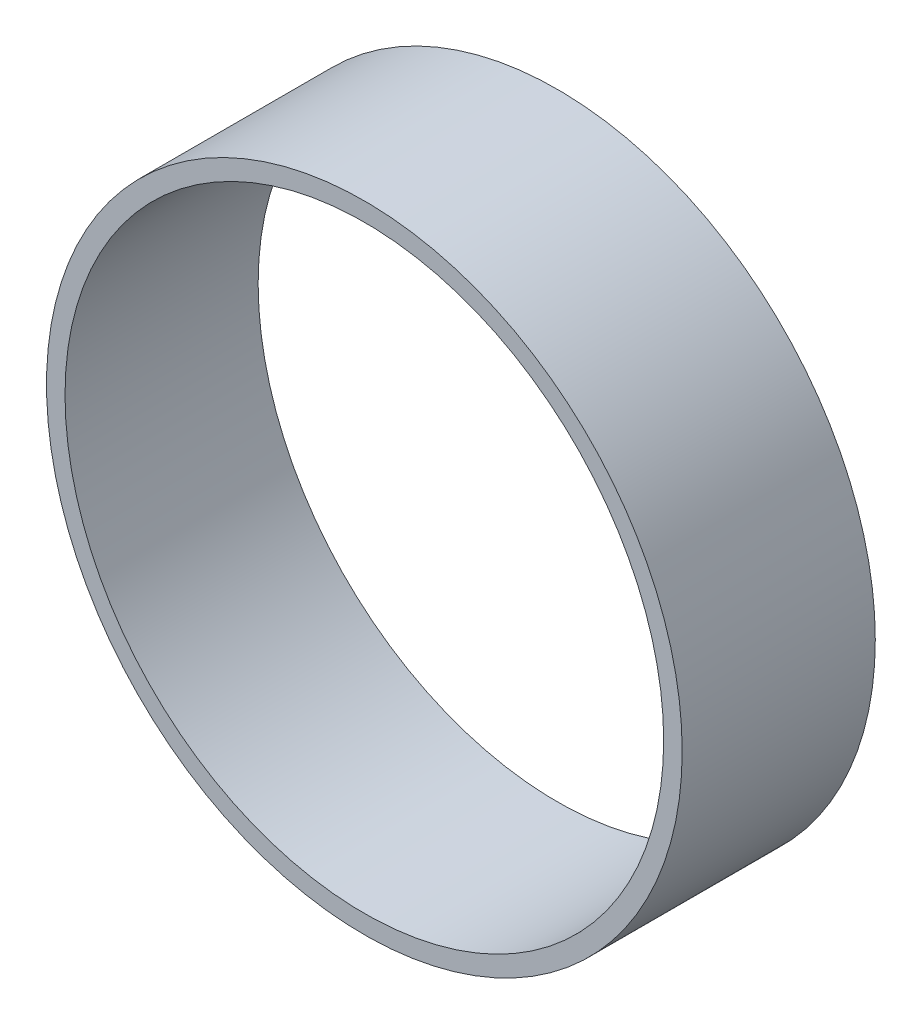
ISO-10303-21;
HEADER;
FILE_DESCRIPTION(('STEP AP214'),'2;1');
FILE_NAME('part.step','',(''),(''),'','','');
FILE_SCHEMA(('AUTOMOTIVE_DESIGN { 1 0 10303 214 1 1 1 1 }'));
ENDSEC;
DATA;
#1=APPLICATION_CONTEXT('core data for automotive mechanical design processes');
#2=APPLICATION_PROTOCOL_DEFINITION('international standard','automotive_design',2000,#1);
#3=PRODUCT_CONTEXT('',#1,'mechanical');
#4=PRODUCT('Part','Part','',(#3));
#5=PRODUCT_RELATED_PRODUCT_CATEGORY('part','',(#4));
#6=PRODUCT_DEFINITION_FORMATION('','',#4);
#7=PRODUCT_DEFINITION_CONTEXT('part definition',#1,'design');
#8=PRODUCT_DEFINITION('design','',#6,#7);
#9=PRODUCT_DEFINITION_SHAPE('','',#8);
#10=(LENGTH_UNIT() NAMED_UNIT(*) SI_UNIT(.MILLI.,.METRE.));
#11=(NAMED_UNIT(*) PLANE_ANGLE_UNIT() SI_UNIT($,.RADIAN.));
#12=(NAMED_UNIT(*) SI_UNIT($,.STERADIAN.) SOLID_ANGLE_UNIT());
#13=UNCERTAINTY_MEASURE_WITH_UNIT(LENGTH_MEASURE(1.E-05),#10,'distance_accuracy_value','');
#14=(GEOMETRIC_REPRESENTATION_CONTEXT(3) GLOBAL_UNCERTAINTY_ASSIGNED_CONTEXT((#13)) GLOBAL_UNIT_ASSIGNED_CONTEXT((#10,
#11,#12)) REPRESENTATION_CONTEXT('',''));
#15=CARTESIAN_POINT('',(0.,0.,0.));
#16=DIRECTION('',(0.,0.,1.));
#17=DIRECTION('',(1.,0.,0.));
#18=AXIS2_PLACEMENT_3D('',#15,#16,#17);
#19=CARTESIAN_POINT('',(0.,0.,12.));
#20=DIRECTION('',(0.,0.,1.));
#21=DIRECTION('',(1.,0.,0.));
#22=AXIS2_PLACEMENT_3D('',#19,#20,#21);
#23=PLANE('',#22);
#24=CARTESIAN_POINT('',(0.,0.,12.));
#25=DIRECTION('',(0.,0.,1.));
#26=DIRECTION('',(1.,0.,0.));
#27=AXIS2_PLACEMENT_3D('',#24,#25,#26);
#28=CIRCLE('',#27,19.75);
#29=CARTESIAN_POINT('',(19.75,0.,12.));
#30=VERTEX_POINT('',#29);
#31=EDGE_CURVE('E10',#30,#30,#28,.T.);
#32=ORIENTED_EDGE('',*,*,#31,.T.);
#33=EDGE_LOOP('',(#32));
#34=FACE_BOUND('',#33,.T.);
#35=CARTESIAN_POINT('',(0.,0.,12.));
#36=DIRECTION('',(0.,0.,1.));
#37=DIRECTION('',(1.,0.,0.));
#38=AXIS2_PLACEMENT_3D('',#35,#36,#37);
#39=CIRCLE('',#38,18.6);
#40=CARTESIAN_POINT('',(18.6,0.,12.));
#41=VERTEX_POINT('',#40);
#42=EDGE_CURVE('E56',#41,#41,#39,.T.);
#43=ORIENTED_EDGE('',*,*,#42,.F.);
#44=EDGE_LOOP('',(#43));
#45=FACE_BOUND('',#44,.T.);
#46=ADVANCED_FACE('F43',(#34,#45),#23,.T.);
#47=CARTESIAN_POINT('',(0.,0.,0.));
#48=DIRECTION('',(0.,0.,1.));
#49=DIRECTION('',(1.,0.,0.));
#50=AXIS2_PLACEMENT_3D('',#47,#48,#49);
#51=PLANE('',#50);
#52=CARTESIAN_POINT('',(0.,0.,0.));
#53=DIRECTION('',(0.,0.,1.));
#54=DIRECTION('',(1.,0.,0.));
#55=AXIS2_PLACEMENT_3D('',#52,#53,#54);
#56=CIRCLE('',#55,19.75);
#57=CARTESIAN_POINT('',(19.75,0.,0.));
#58=VERTEX_POINT('',#57);
#59=EDGE_CURVE('E47',#58,#58,#56,.T.);
#60=ORIENTED_EDGE('',*,*,#59,.F.);
#61=EDGE_LOOP('',(#60));
#62=FACE_BOUND('',#61,.T.);
#63=CARTESIAN_POINT('',(0.,0.,0.));
#64=DIRECTION('',(0.,0.,1.));
#65=DIRECTION('',(1.,0.,0.));
#66=AXIS2_PLACEMENT_3D('',#63,#64,#65);
#67=CIRCLE('',#66,18.6);
#68=CARTESIAN_POINT('',(18.6,0.,0.));
#69=VERTEX_POINT('',#68);
#70=EDGE_CURVE('E58',#69,#69,#67,.T.);
#71=ORIENTED_EDGE('',*,*,#70,.T.);
#72=EDGE_LOOP('',(#71));
#73=FACE_BOUND('',#72,.T.);
#74=ADVANCED_FACE('F70',(#62,#73),#51,.F.);
#75=CARTESIAN_POINT('',(0.,0.,12.));
#76=DIRECTION('',(0.,0.,-1.));
#77=DIRECTION('',(-1.,0.,0.));
#78=AXIS2_PLACEMENT_3D('',#75,#76,#77);
#79=CYLINDRICAL_SURFACE('',#78,19.75);
#80=ORIENTED_EDGE('',*,*,#31,.F.);
#81=EDGE_LOOP('',(#80));
#82=FACE_BOUND('',#81,.T.);
#83=ORIENTED_EDGE('',*,*,#59,.T.);
#84=EDGE_LOOP('',(#83));
#85=FACE_BOUND('',#84,.T.);
#86=ADVANCED_FACE('F45',(#82,#85),#79,.T.);
#87=CARTESIAN_POINT('',(0.,0.,12.));
#88=DIRECTION('',(0.,0.,-1.));
#89=DIRECTION('',(-1.,0.,0.));
#90=AXIS2_PLACEMENT_3D('',#87,#88,#89);
#91=CYLINDRICAL_SURFACE('',#90,18.6);
#92=ORIENTED_EDGE('',*,*,#42,.T.);
#93=EDGE_LOOP('',(#92));
#94=FACE_BOUND('',#93,.T.);
#95=ORIENTED_EDGE('',*,*,#70,.F.);
#96=EDGE_LOOP('',(#95));
#97=FACE_BOUND('',#96,.T.);
#98=ADVANCED_FACE('F66',(#94,#97),#91,.F.);
#99=CLOSED_SHELL('',(#46,#74,#86,#98));
#100=MANIFOLD_SOLID_BREP('B2',#99);
#101=ADVANCED_BREP_SHAPE_REPRESENTATION('',(#18,#100),#14);
#102=SHAPE_DEFINITION_REPRESENTATION(#9,#101);
ENDSEC;
END-ISO-10303-21;
